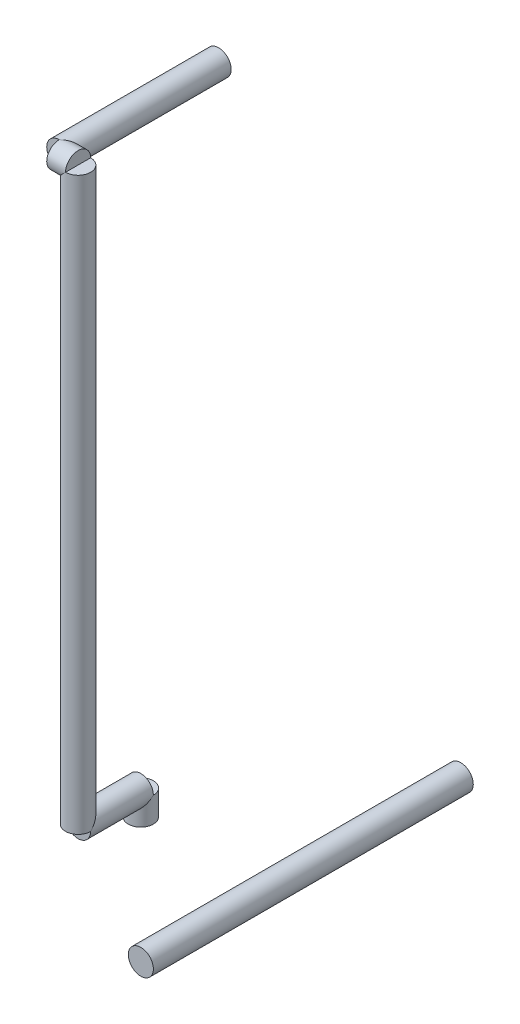
ISO-10303-21;
HEADER;
FILE_DESCRIPTION(('STEP AP214'),'2;1');
FILE_NAME('part.step','',(''),(''),'','','');
FILE_SCHEMA(('AUTOMOTIVE_DESIGN { 1 0 10303 214 1 1 1 1 }'));
ENDSEC;
DATA;
#1=APPLICATION_CONTEXT('core data for automotive mechanical design processes');
#2=APPLICATION_PROTOCOL_DEFINITION('international standard','automotive_design',2000,#1);
#3=PRODUCT_CONTEXT('',#1,'mechanical');
#4=PRODUCT('Part','Part','',(#3));
#5=PRODUCT_RELATED_PRODUCT_CATEGORY('part','',(#4));
#6=PRODUCT_DEFINITION_FORMATION('','',#4);
#7=PRODUCT_DEFINITION_CONTEXT('part definition',#1,'design');
#8=PRODUCT_DEFINITION('design','',#6,#7);
#9=PRODUCT_DEFINITION_SHAPE('','',#8);
#10=(LENGTH_UNIT() NAMED_UNIT(*) SI_UNIT(.MILLI.,.METRE.));
#11=(NAMED_UNIT(*) PLANE_ANGLE_UNIT() SI_UNIT($,.RADIAN.));
#12=(NAMED_UNIT(*) SI_UNIT($,.STERADIAN.) SOLID_ANGLE_UNIT());
#13=UNCERTAINTY_MEASURE_WITH_UNIT(LENGTH_MEASURE(1.E-05),#10,'distance_accuracy_value','');
#14=(GEOMETRIC_REPRESENTATION_CONTEXT(3) GLOBAL_UNCERTAINTY_ASSIGNED_CONTEXT((#13)) GLOBAL_UNIT_ASSIGNED_CONTEXT((#10,
#11,#12)) REPRESENTATION_CONTEXT('',''));
#15=CARTESIAN_POINT('',(0.,0.,0.));
#16=DIRECTION('',(0.,0.,1.));
#17=DIRECTION('',(1.,0.,0.));
#18=AXIS2_PLACEMENT_3D('',#15,#16,#17);
#19=CARTESIAN_POINT('',(32.,20.5,36.));
#20=DIRECTION('',(-1.,0.,0.));
#21=DIRECTION('',(0.,0.,1.));
#22=AXIS2_PLACEMENT_3D('',#19,#20,#21);
#23=CYLINDRICAL_SURFACE('',#22,2.);
#24=CARTESIAN_POINT('',(32.,20.5,36.));
#25=DIRECTION('',(1.,0.,0.));
#26=DIRECTION('',(0.,0.,-1.));
#27=AXIS2_PLACEMENT_3D('',#24,#25,#26);
#28=CIRCLE('',#27,2.);
#29=CARTESIAN_POINT('',(32.,20.5,34.));
#30=VERTEX_POINT('',#29);
#31=CARTESIAN_POINT('',(32.,20.5,38.));
#32=VERTEX_POINT('',#31);
#33=EDGE_CURVE('E98',#30,#32,#28,.T.);
#34=ORIENTED_EDGE('',*,*,#33,.F.);
#35=CARTESIAN_POINT('',(32.,20.5,36.));
#36=DIRECTION('',(0.707106781186547,-0.707106781186547,0.));
#37=DIRECTION('',(-0.707106781186547,-0.707106781186547,0.));
#38=AXIS2_PLACEMENT_3D('',#35,#36,#37);
#39=ELLIPSE('',#38,2.82842712474619,2.);
#40=EDGE_CURVE('E101',#30,#32,#39,.F.);
#41=ORIENTED_EDGE('',*,*,#40,.T.);
#42=EDGE_LOOP('',(#34,#41));
#43=FACE_BOUND('',#42,.T.);
#44=CARTESIAN_POINT('',(29.,20.5,36.));
#45=DIRECTION('',(-0.707106781186547,0.,-0.707106781186547));
#46=DIRECTION('',(-0.707106781186547,0.,0.707106781186547));
#47=AXIS2_PLACEMENT_3D('',#44,#45,#46);
#48=ELLIPSE('',#47,2.82842712474619,2.);
#49=CARTESIAN_POINT('',(29.,22.5,36.));
#50=VERTEX_POINT('',#49);
#51=CARTESIAN_POINT('',(29.,18.5,36.));
#52=VERTEX_POINT('',#51);
#53=EDGE_CURVE('E91',#50,#52,#48,.T.);
#54=ORIENTED_EDGE('',*,*,#53,.F.);
#55=CARTESIAN_POINT('',(29.,20.5,36.));
#56=DIRECTION('',(1.,0.,0.));
#57=DIRECTION('',(0.,0.,-1.));
#58=AXIS2_PLACEMENT_3D('',#55,#56,#57);
#59=CIRCLE('',#58,2.);
#60=EDGE_CURVE('E95',#50,#52,#59,.T.);
#61=ORIENTED_EDGE('',*,*,#60,.T.);
#62=EDGE_LOOP('',(#54,#61));
#63=FACE_BOUND('',#62,.T.);
#64=ADVANCED_FACE('F47',(#43,#63),#23,.T.);
#65=CARTESIAN_POINT('',(32.,20.5,36.));
#66=DIRECTION('',(0.,-1.,0.));
#67=DIRECTION('',(0.,0.,-1.));
#68=AXIS2_PLACEMENT_3D('',#65,#66,#67);
#69=CYLINDRICAL_SURFACE('',#68,2.);
#70=CARTESIAN_POINT('',(32.,-70.5,36.));
#71=DIRECTION('',(0.,1.,0.));
#72=DIRECTION('',(0.,0.,1.));
#73=AXIS2_PLACEMENT_3D('',#70,#71,#72);
#74=CIRCLE('',#73,2.);
#75=CARTESIAN_POINT('',(30.,-70.5,36.));
#76=VERTEX_POINT('',#75);
#77=CARTESIAN_POINT('',(34.,-70.5,36.));
#78=VERTEX_POINT('',#77);
#79=EDGE_CURVE('E106',#76,#78,#74,.T.);
#80=ORIENTED_EDGE('',*,*,#79,.T.);
#81=CARTESIAN_POINT('',(32.,-70.5,36.));
#82=DIRECTION('',(0.,-0.707106781186547,-0.707106781186547));
#83=DIRECTION('',(0.,0.707106781186547,-0.707106781186547));
#84=AXIS2_PLACEMENT_3D('',#81,#82,#83);
#85=ELLIPSE('',#84,2.82842712474619,2.);
#86=EDGE_CURVE('E109',#78,#76,#85,.F.);
#87=ORIENTED_EDGE('',*,*,#86,.T.);
#88=EDGE_LOOP('',(#80,#87));
#89=FACE_BOUND('',#88,.T.);
#90=ORIENTED_EDGE('',*,*,#40,.F.);
#91=CARTESIAN_POINT('',(32.,20.5,36.));
#92=DIRECTION('',(0.,1.,0.));
#93=DIRECTION('',(0.,0.,1.));
#94=AXIS2_PLACEMENT_3D('',#91,#92,#93);
#95=CIRCLE('',#94,2.);
#96=EDGE_CURVE('E107',#32,#30,#95,.T.);
#97=ORIENTED_EDGE('',*,*,#96,.F.);
#98=EDGE_LOOP('',(#90,#97));
#99=FACE_BOUND('',#98,.T.);
#100=ADVANCED_FACE('F140',(#89,#99),#69,.T.);
#101=CARTESIAN_POINT('',(32.,-70.5,36.));
#102=DIRECTION('',(0.,0.,-1.));
#103=DIRECTION('',(-1.,0.,0.));
#104=AXIS2_PLACEMENT_3D('',#101,#102,#103);
#105=CYLINDRICAL_SURFACE('',#104,2.);
#106=CARTESIAN_POINT('',(32.,-70.5,26.));
#107=DIRECTION('',(0.,0.,1.));
#108=DIRECTION('',(1.,0.,0.));
#109=AXIS2_PLACEMENT_3D('',#106,#107,#108);
#110=CIRCLE('',#109,2.);
#111=CARTESIAN_POINT('',(34.,-70.5,26.));
#112=VERTEX_POINT('',#111);
#113=CARTESIAN_POINT('',(30.,-70.5,26.));
#114=VERTEX_POINT('',#113);
#115=EDGE_CURVE('E114',#112,#114,#110,.T.);
#116=ORIENTED_EDGE('',*,*,#115,.T.);
#117=CARTESIAN_POINT('',(32.,-70.5,26.));
#118=DIRECTION('',(0.,-0.707106781186547,-0.707106781186547));
#119=DIRECTION('',(0.,-0.707106781186547,0.707106781186547));
#120=AXIS2_PLACEMENT_3D('',#117,#118,#119);
#121=ELLIPSE('',#120,2.82842712474619,2.);
#122=EDGE_CURVE('E118',#114,#112,#121,.F.);
#123=ORIENTED_EDGE('',*,*,#122,.T.);
#124=EDGE_LOOP('',(#116,#123));
#125=FACE_BOUND('',#124,.T.);
#126=ORIENTED_EDGE('',*,*,#86,.F.);
#127=CARTESIAN_POINT('',(32.,-70.5,36.));
#128=DIRECTION('',(0.,0.,1.));
#129=DIRECTION('',(1.,0.,0.));
#130=AXIS2_PLACEMENT_3D('',#127,#128,#129);
#131=CIRCLE('',#130,2.);
#132=EDGE_CURVE('E115',#76,#78,#131,.T.);
#133=ORIENTED_EDGE('',*,*,#132,.F.);
#134=EDGE_LOOP('',(#126,#133));
#135=FACE_BOUND('',#134,.T.);
#136=ADVANCED_FACE('F160',(#125,#135),#105,.T.);
#137=CARTESIAN_POINT('',(32.,-70.5,36.));
#138=DIRECTION('',(0.,0.,1.));
#139=DIRECTION('',(1.,0.,0.));
#140=AXIS2_PLACEMENT_3D('',#137,#138,#139);
#141=PLANE('',#140);
#142=ORIENTED_EDGE('',*,*,#132,.T.);
#143=DIRECTION('',(-1.,0.,0.));
#144=VECTOR('',#143,1.);
#145=CARTESIAN_POINT('',(32.,-70.5,36.));
#146=LINE('',#145,#144);
#147=EDGE_CURVE('E132',#78,#76,#146,.T.);
#148=ORIENTED_EDGE('',*,*,#147,.T.);
#149=EDGE_LOOP('',(#142,#148));
#150=FACE_BOUND('',#149,.T.);
#151=ADVANCED_FACE('F218',(#150),#141,.T.);
#152=CARTESIAN_POINT('',(32.,-70.5,26.));
#153=DIRECTION('',(0.,-1.,0.));
#154=DIRECTION('',(0.,0.,-1.));
#155=AXIS2_PLACEMENT_3D('',#152,#153,#154);
#156=CYLINDRICAL_SURFACE('',#155,2.);
#157=CARTESIAN_POINT('',(32.,-74.5,26.));
#158=DIRECTION('',(0.,1.,0.));
#159=DIRECTION('',(0.,0.,1.));
#160=AXIS2_PLACEMENT_3D('',#157,#158,#159);
#161=CIRCLE('',#160,2.);
#162=CARTESIAN_POINT('',(32.,-74.5,28.));
#163=VERTEX_POINT('',#162);
#164=EDGE_CURVE('E123',#163,#163,#161,.T.);
#165=ORIENTED_EDGE('',*,*,#164,.T.);
#166=EDGE_LOOP('',(#165));
#167=FACE_BOUND('',#166,.T.);
#168=ORIENTED_EDGE('',*,*,#122,.F.);
#169=CARTESIAN_POINT('',(32.,-70.5,26.));
#170=DIRECTION('',(0.,1.,0.));
#171=DIRECTION('',(0.,0.,1.));
#172=AXIS2_PLACEMENT_3D('',#169,#170,#171);
#173=CIRCLE('',#172,2.);
#174=EDGE_CURVE('E124',#112,#114,#173,.T.);
#175=ORIENTED_EDGE('',*,*,#174,.F.);
#176=EDGE_LOOP('',(#168,#175));
#177=FACE_BOUND('',#176,.T.);
#178=ADVANCED_FACE('F49',(#167,#177),#156,.T.);
#179=CARTESIAN_POINT('',(32.,-70.5,26.));
#180=DIRECTION('',(0.,1.,0.));
#181=DIRECTION('',(0.,0.,1.));
#182=AXIS2_PLACEMENT_3D('',#179,#180,#181);
#183=PLANE('',#182);
#184=ORIENTED_EDGE('',*,*,#174,.T.);
#185=DIRECTION('',(1.,0.,0.));
#186=VECTOR('',#185,1.);
#187=CARTESIAN_POINT('',(32.,-70.5,26.));
#188=LINE('',#187,#186);
#189=EDGE_CURVE('E127',#114,#112,#188,.T.);
#190=ORIENTED_EDGE('',*,*,#189,.T.);
#191=EDGE_LOOP('',(#184,#190));
#192=FACE_BOUND('',#191,.T.);
#193=ADVANCED_FACE('F243',(#192),#183,.T.);
#194=CARTESIAN_POINT('',(32.,-74.5,26.));
#195=DIRECTION('',(0.,1.,0.));
#196=DIRECTION('',(0.,0.,1.));
#197=AXIS2_PLACEMENT_3D('',#194,#195,#196);
#198=PLANE('',#197);
#199=ORIENTED_EDGE('',*,*,#164,.F.);
#200=EDGE_LOOP('',(#199));
#201=FACE_BOUND('',#200,.T.);
#202=ADVANCED_FACE('F152',(#201),#198,.F.);
#203=CARTESIAN_POINT('',(32.,-70.5,26.));
#204=DIRECTION('',(0.,0.,1.));
#205=DIRECTION('',(1.,0.,0.));
#206=AXIS2_PLACEMENT_3D('',#203,#204,#205);
#207=PLANE('',#206);
#208=ORIENTED_EDGE('',*,*,#189,.F.);
#209=ORIENTED_EDGE('',*,*,#115,.F.);
#210=EDGE_LOOP('',(#208,#209));
#211=FACE_BOUND('',#210,.T.);
#212=ADVANCED_FACE('F144',(#211),#207,.F.);
#213=CARTESIAN_POINT('',(32.,20.5,36.));
#214=DIRECTION('',(0.,1.,0.));
#215=DIRECTION('',(0.,0.,1.));
#216=AXIS2_PLACEMENT_3D('',#213,#214,#215);
#217=PLANE('',#216);
#218=DIRECTION('',(0.,0.,-1.));
#219=VECTOR('',#218,1.);
#220=CARTESIAN_POINT('',(32.,20.5,36.));
#221=LINE('',#220,#219);
#222=EDGE_CURVE('E55',#32,#30,#221,.T.);
#223=ORIENTED_EDGE('',*,*,#222,.F.);
#224=ORIENTED_EDGE('',*,*,#96,.T.);
#225=EDGE_LOOP('',(#223,#224));
#226=FACE_BOUND('',#225,.T.);
#227=ADVANCED_FACE('F141',(#226),#217,.T.);
#228=CARTESIAN_POINT('',(32.,-70.5,36.));
#229=DIRECTION('',(0.,1.,0.));
#230=DIRECTION('',(0.,0.,1.));
#231=AXIS2_PLACEMENT_3D('',#228,#229,#230);
#232=PLANE('',#231);
#233=ORIENTED_EDGE('',*,*,#147,.F.);
#234=ORIENTED_EDGE('',*,*,#79,.F.);
#235=EDGE_LOOP('',(#233,#234));
#236=FACE_BOUND('',#235,.T.);
#237=ADVANCED_FACE('F143',(#236),#232,.F.);
#238=CARTESIAN_POINT('',(32.,20.5,36.));
#239=DIRECTION('',(1.,0.,0.));
#240=DIRECTION('',(0.,0.,-1.));
#241=AXIS2_PLACEMENT_3D('',#238,#239,#240);
#242=PLANE('',#241);
#243=ORIENTED_EDGE('',*,*,#33,.T.);
#244=ORIENTED_EDGE('',*,*,#222,.T.);
#245=EDGE_LOOP('',(#243,#244));
#246=FACE_BOUND('',#245,.T.);
#247=ADVANCED_FACE('F136',(#246),#242,.T.);
#248=CARTESIAN_POINT('',(29.,20.5,36.));
#249=DIRECTION('',(1.,0.,0.));
#250=DIRECTION('',(0.,0.,-1.));
#251=AXIS2_PLACEMENT_3D('',#248,#249,#250);
#252=PLANE('',#251);
#253=ORIENTED_EDGE('',*,*,#60,.F.);
#254=DIRECTION('',(0.,-1.,0.));
#255=VECTOR('',#254,1.);
#256=CARTESIAN_POINT('',(29.,20.5,36.));
#257=LINE('',#256,#255);
#258=EDGE_CURVE('E12',#50,#52,#257,.T.);
#259=ORIENTED_EDGE('',*,*,#258,.T.);
#260=EDGE_LOOP('',(#253,#259));
#261=FACE_BOUND('',#260,.T.);
#262=ADVANCED_FACE('F97',(#261),#252,.F.);
#263=CARTESIAN_POINT('',(29.,20.5,36.));
#264=DIRECTION('',(0.,0.,-1.));
#265=DIRECTION('',(-1.,0.,0.));
#266=AXIS2_PLACEMENT_3D('',#263,#264,#265);
#267=CYLINDRICAL_SURFACE('',#266,2.);
#268=CARTESIAN_POINT('',(29.,20.5,10.6));
#269=DIRECTION('',(0.,0.,1.));
#270=DIRECTION('',(1.,0.,0.));
#271=AXIS2_PLACEMENT_3D('',#268,#269,#270);
#272=CIRCLE('',#271,2.);
#273=CARTESIAN_POINT('',(31.,20.5,10.6));
#274=VERTEX_POINT('',#273);
#275=EDGE_CURVE('E92',#274,#274,#272,.T.);
#276=ORIENTED_EDGE('',*,*,#275,.T.);
#277=EDGE_LOOP('',(#276));
#278=FACE_BOUND('',#277,.T.);
#279=CARTESIAN_POINT('',(29.,20.5,36.));
#280=DIRECTION('',(0.,0.,1.));
#281=DIRECTION('',(1.,0.,0.));
#282=AXIS2_PLACEMENT_3D('',#279,#280,#281);
#283=CIRCLE('',#282,2.);
#284=EDGE_CURVE('E61',#50,#52,#283,.T.);
#285=ORIENTED_EDGE('',*,*,#284,.F.);
#286=ORIENTED_EDGE('',*,*,#53,.T.);
#287=EDGE_LOOP('',(#285,#286));
#288=FACE_BOUND('',#287,.T.);
#289=ADVANCED_FACE('F90',(#278,#288),#267,.T.);
#290=CARTESIAN_POINT('',(29.,20.5,36.));
#291=DIRECTION('',(0.,0.,1.));
#292=DIRECTION('',(1.,0.,0.));
#293=AXIS2_PLACEMENT_3D('',#290,#291,#292);
#294=PLANE('',#293);
#295=ORIENTED_EDGE('',*,*,#258,.F.);
#296=ORIENTED_EDGE('',*,*,#284,.T.);
#297=EDGE_LOOP('',(#295,#296));
#298=FACE_BOUND('',#297,.T.);
#299=ADVANCED_FACE('F84',(#298),#294,.T.);
#300=CARTESIAN_POINT('',(29.,20.5,10.6));
#301=DIRECTION('',(0.,0.,1.));
#302=DIRECTION('',(1.,0.,0.));
#303=AXIS2_PLACEMENT_3D('',#300,#301,#302);
#304=PLANE('',#303);
#305=ORIENTED_EDGE('',*,*,#275,.F.);
#306=EDGE_LOOP('',(#305));
#307=FACE_BOUND('',#306,.T.);
#308=ADVANCED_FACE('F171',(#307),#304,.F.);
#309=CLOSED_SHELL('',(#64,#100,#136,#151,#178,#193,#202,#212,#227,#237,#247,#262,#289,#299,#308));
#310=MANIFOLD_SOLID_BREP('B2',#309);
#311=CARTESIAN_POINT('',(32.,-94.5,26.));
#312=DIRECTION('',(0.,0.,-1.));
#313=DIRECTION('',(-1.,0.,0.));
#314=AXIS2_PLACEMENT_3D('',#311,#312,#313);
#315=CYLINDRICAL_SURFACE('',#314,2.);
#316=CARTESIAN_POINT('',(32.,-94.5,26.));
#317=DIRECTION('',(0.,0.,1.));
#318=DIRECTION('',(1.,0.,0.));
#319=AXIS2_PLACEMENT_3D('',#316,#317,#318);
#320=CIRCLE('',#319,2.);
#321=CARTESIAN_POINT('',(34.,-94.5,26.));
#322=VERTEX_POINT('',#321);
#323=EDGE_CURVE('E46',#322,#322,#320,.T.);
#324=ORIENTED_EDGE('',*,*,#323,.F.);
#325=EDGE_LOOP('',(#324));
#326=FACE_BOUND('',#325,.T.);
#327=CARTESIAN_POINT('',(32.,-94.5,-25.));
#328=DIRECTION('',(0.,0.,1.));
#329=DIRECTION('',(1.,0.,0.));
#330=AXIS2_PLACEMENT_3D('',#327,#328,#329);
#331=CIRCLE('',#330,2.);
#332=CARTESIAN_POINT('',(34.,-94.5,-25.));
#333=VERTEX_POINT('',#332);
#334=EDGE_CURVE('E353',#333,#333,#331,.T.);
#335=ORIENTED_EDGE('',*,*,#334,.T.);
#336=EDGE_LOOP('',(#335));
#337=FACE_BOUND('',#336,.T.);
#338=ADVANCED_FACE('F350',(#326,#337),#315,.T.);
#339=CARTESIAN_POINT('',(32.,-94.5,26.));
#340=DIRECTION('',(0.,0.,1.));
#341=DIRECTION('',(1.,0.,0.));
#342=AXIS2_PLACEMENT_3D('',#339,#340,#341);
#343=PLANE('',#342);
#344=ORIENTED_EDGE('',*,*,#323,.T.);
#345=EDGE_LOOP('',(#344));
#346=FACE_BOUND('',#345,.T.);
#347=ADVANCED_FACE('F365',(#346),#343,.T.);
#348=CARTESIAN_POINT('',(32.,-94.5,-25.));
#349=DIRECTION('',(0.,0.,1.));
#350=DIRECTION('',(1.,0.,0.));
#351=AXIS2_PLACEMENT_3D('',#348,#349,#350);
#352=PLANE('',#351);
#353=ORIENTED_EDGE('',*,*,#334,.F.);
#354=EDGE_LOOP('',(#353));
#355=FACE_BOUND('',#354,.T.);
#356=ADVANCED_FACE('F363',(#355),#352,.F.);
#357=CLOSED_SHELL('',(#338,#347,#356));
#358=MANIFOLD_SOLID_BREP('B6',#357);
#359=ADVANCED_BREP_SHAPE_REPRESENTATION('',(#18,#310,#358),#14);
#360=SHAPE_DEFINITION_REPRESENTATION(#9,#359);
ENDSEC;
END-ISO-10303-21;
